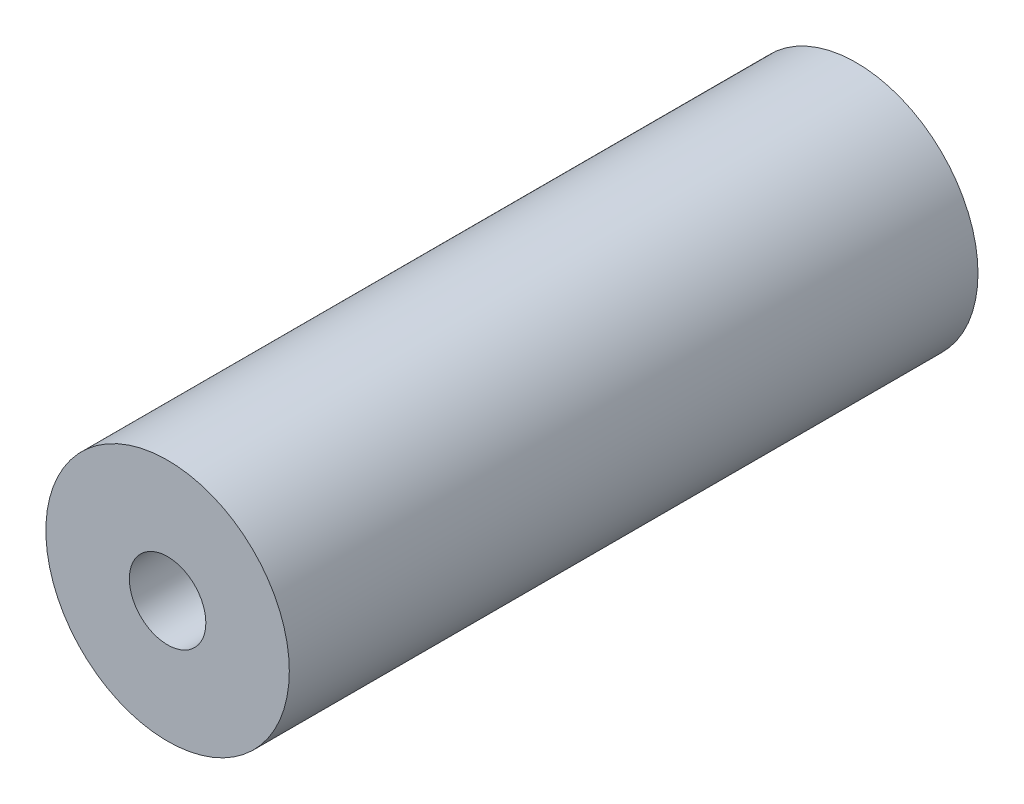
ISO-10303-21;
HEADER;
FILE_DESCRIPTION(('STEP AP214'),'2;1');
FILE_NAME('part.step','',(''),(''),'','','');
FILE_SCHEMA(('AUTOMOTIVE_DESIGN { 1 0 10303 214 1 1 1 1 }'));
ENDSEC;
DATA;
#1=APPLICATION_CONTEXT('core data for automotive mechanical design processes');
#2=APPLICATION_PROTOCOL_DEFINITION('international standard','automotive_design',2000,#1);
#3=PRODUCT_CONTEXT('',#1,'mechanical');
#4=PRODUCT('Part','Part','',(#3));
#5=PRODUCT_RELATED_PRODUCT_CATEGORY('part','',(#4));
#6=PRODUCT_DEFINITION_FORMATION('','',#4);
#7=PRODUCT_DEFINITION_CONTEXT('part definition',#1,'design');
#8=PRODUCT_DEFINITION('design','',#6,#7);
#9=PRODUCT_DEFINITION_SHAPE('','',#8);
#10=(LENGTH_UNIT() NAMED_UNIT(*) SI_UNIT(.MILLI.,.METRE.));
#11=(NAMED_UNIT(*) PLANE_ANGLE_UNIT() SI_UNIT($,.RADIAN.));
#12=(NAMED_UNIT(*) SI_UNIT($,.STERADIAN.) SOLID_ANGLE_UNIT());
#13=UNCERTAINTY_MEASURE_WITH_UNIT(LENGTH_MEASURE(1.E-05),#10,'distance_accuracy_value','');
#14=(GEOMETRIC_REPRESENTATION_CONTEXT(3) GLOBAL_UNCERTAINTY_ASSIGNED_CONTEXT((#13)) GLOBAL_UNIT_ASSIGNED_CONTEXT((#10,
#11,#12)) REPRESENTATION_CONTEXT('',''));
#15=CARTESIAN_POINT('',(0.,0.,0.));
#16=DIRECTION('',(0.,0.,1.));
#17=DIRECTION('',(1.,0.,0.));
#18=AXIS2_PLACEMENT_3D('',#15,#16,#17);
#19=CARTESIAN_POINT('',(0.,0.,0.));
#20=DIRECTION('',(0.,0.,1.));
#21=DIRECTION('',(1.,0.,0.));
#22=AXIS2_PLACEMENT_3D('',#19,#20,#21);
#23=CYLINDRICAL_SURFACE('',#22,2.5);
#24=CARTESIAN_POINT('',(0.,0.,0.));
#25=DIRECTION('',(0.,0.,1.));
#26=DIRECTION('',(1.,0.,0.));
#27=AXIS2_PLACEMENT_3D('',#24,#25,#26);
#28=CIRCLE('',#27,2.5);
#29=CARTESIAN_POINT('',(2.5,0.,0.));
#30=VERTEX_POINT('',#29);
#31=EDGE_CURVE('E45',#30,#30,#28,.T.);
#32=ORIENTED_EDGE('',*,*,#31,.F.);
#33=EDGE_LOOP('',(#32));
#34=FACE_BOUND('',#33,.T.);
#35=CARTESIAN_POINT('',(0.,0.,5.));
#36=DIRECTION('',(0.,0.,1.));
#37=DIRECTION('',(1.,0.,0.));
#38=AXIS2_PLACEMENT_3D('',#35,#36,#37);
#39=CIRCLE('',#38,2.5);
#40=CARTESIAN_POINT('',(2.5,0.,5.));
#41=VERTEX_POINT('',#40);
#42=EDGE_CURVE('E36',#41,#41,#39,.F.);
#43=ORIENTED_EDGE('',*,*,#42,.F.);
#44=EDGE_LOOP('',(#43));
#45=FACE_BOUND('',#44,.T.);
#46=ADVANCED_FACE('F32',(#34,#45),#23,.F.);
#47=CARTESIAN_POINT('',(0.,0.,99.));
#48=DIRECTION('',(0.,0.,-1.));
#49=DIRECTION('',(-1.,0.,0.));
#50=AXIS2_PLACEMENT_3D('',#47,#48,#49);
#51=CYLINDRICAL_SURFACE('',#50,17.5);
#52=CARTESIAN_POINT('',(0.,0.,99.));
#53=DIRECTION('',(0.,0.,1.));
#54=DIRECTION('',(1.,0.,0.));
#55=AXIS2_PLACEMENT_3D('',#52,#53,#54);
#56=CIRCLE('',#55,17.5);
#57=CARTESIAN_POINT('',(17.5,0.,99.));
#58=VERTEX_POINT('',#57);
#59=EDGE_CURVE('E10',#58,#58,#56,.T.);
#60=ORIENTED_EDGE('',*,*,#59,.F.);
#61=EDGE_LOOP('',(#60));
#62=FACE_BOUND('',#61,.T.);
#63=CARTESIAN_POINT('',(0.,0.,0.));
#64=DIRECTION('',(0.,0.,1.));
#65=DIRECTION('',(1.,0.,0.));
#66=AXIS2_PLACEMENT_3D('',#63,#64,#65);
#67=CIRCLE('',#66,17.5);
#68=CARTESIAN_POINT('',(17.5,0.,0.));
#69=VERTEX_POINT('',#68);
#70=EDGE_CURVE('E40',#69,#69,#67,.T.);
#71=ORIENTED_EDGE('',*,*,#70,.T.);
#72=EDGE_LOOP('',(#71));
#73=FACE_BOUND('',#72,.T.);
#74=ADVANCED_FACE('F34',(#62,#73),#51,.T.);
#75=CARTESIAN_POINT('',(0.,0.,99.));
#76=DIRECTION('',(0.,0.,1.));
#77=DIRECTION('',(1.,0.,0.));
#78=AXIS2_PLACEMENT_3D('',#75,#76,#77);
#79=PLANE('',#78);
#80=CARTESIAN_POINT('',(0.,0.,99.));
#81=DIRECTION('',(0.,0.,1.));
#82=DIRECTION('',(1.,0.,0.));
#83=AXIS2_PLACEMENT_3D('',#80,#81,#82);
#84=CIRCLE('',#83,5.5);
#85=CARTESIAN_POINT('',(5.5,0.,99.));
#86=VERTEX_POINT('',#85);
#87=EDGE_CURVE('E49',#86,#86,#84,.T.);
#88=ORIENTED_EDGE('',*,*,#87,.F.);
#89=EDGE_LOOP('',(#88));
#90=FACE_BOUND('',#89,.T.);
#91=ORIENTED_EDGE('',*,*,#59,.T.);
#92=EDGE_LOOP('',(#91));
#93=FACE_BOUND('',#92,.T.);
#94=ADVANCED_FACE('F67',(#90,#93),#79,.T.);
#95=CARTESIAN_POINT('',(0.,0.,0.));
#96=DIRECTION('',(0.,0.,1.));
#97=DIRECTION('',(1.,0.,0.));
#98=AXIS2_PLACEMENT_3D('',#95,#96,#97);
#99=PLANE('',#98);
#100=ORIENTED_EDGE('',*,*,#31,.T.);
#101=EDGE_LOOP('',(#100));
#102=FACE_BOUND('',#101,.T.);
#103=ORIENTED_EDGE('',*,*,#70,.F.);
#104=EDGE_LOOP('',(#103));
#105=FACE_BOUND('',#104,.T.);
#106=ADVANCED_FACE('F75',(#102,#105),#99,.F.);
#107=CARTESIAN_POINT('',(0.,0.,5.));
#108=DIRECTION('',(0.,0.,1.));
#109=DIRECTION('',(1.,0.,0.));
#110=AXIS2_PLACEMENT_3D('',#107,#108,#109);
#111=PLANE('',#110);
#112=CARTESIAN_POINT('',(0.,0.,5.));
#113=DIRECTION('',(0.,0.,1.));
#114=DIRECTION('',(1.,0.,0.));
#115=AXIS2_PLACEMENT_3D('',#112,#113,#114);
#116=CIRCLE('',#115,5.5);
#117=CARTESIAN_POINT('',(5.5,0.,5.));
#118=VERTEX_POINT('',#117);
#119=EDGE_CURVE('E52',#118,#118,#116,.T.);
#120=ORIENTED_EDGE('',*,*,#119,.T.);
#121=EDGE_LOOP('',(#120));
#122=FACE_BOUND('',#121,.T.);
#123=ORIENTED_EDGE('',*,*,#42,.T.);
#124=EDGE_LOOP('',(#123));
#125=FACE_BOUND('',#124,.T.);
#126=ADVANCED_FACE('F59',(#122,#125),#111,.T.);
#127=CARTESIAN_POINT('',(0.,0.,5.));
#128=DIRECTION('',(0.,0.,1.));
#129=DIRECTION('',(1.,0.,0.));
#130=AXIS2_PLACEMENT_3D('',#127,#128,#129);
#131=CYLINDRICAL_SURFACE('',#130,5.5);
#132=ORIENTED_EDGE('',*,*,#119,.F.);
#133=EDGE_LOOP('',(#132));
#134=FACE_BOUND('',#133,.T.);
#135=ORIENTED_EDGE('',*,*,#87,.T.);
#136=EDGE_LOOP('',(#135));
#137=FACE_BOUND('',#136,.T.);
#138=ADVANCED_FACE('F72',(#134,#137),#131,.F.);
#139=CLOSED_SHELL('',(#46,#74,#94,#106,#126,#138));
#140=MANIFOLD_SOLID_BREP('B2',#139);
#141=ADVANCED_BREP_SHAPE_REPRESENTATION('',(#18,#140),#14);
#142=SHAPE_DEFINITION_REPRESENTATION(#9,#141);
ENDSEC;
END-ISO-10303-21;
